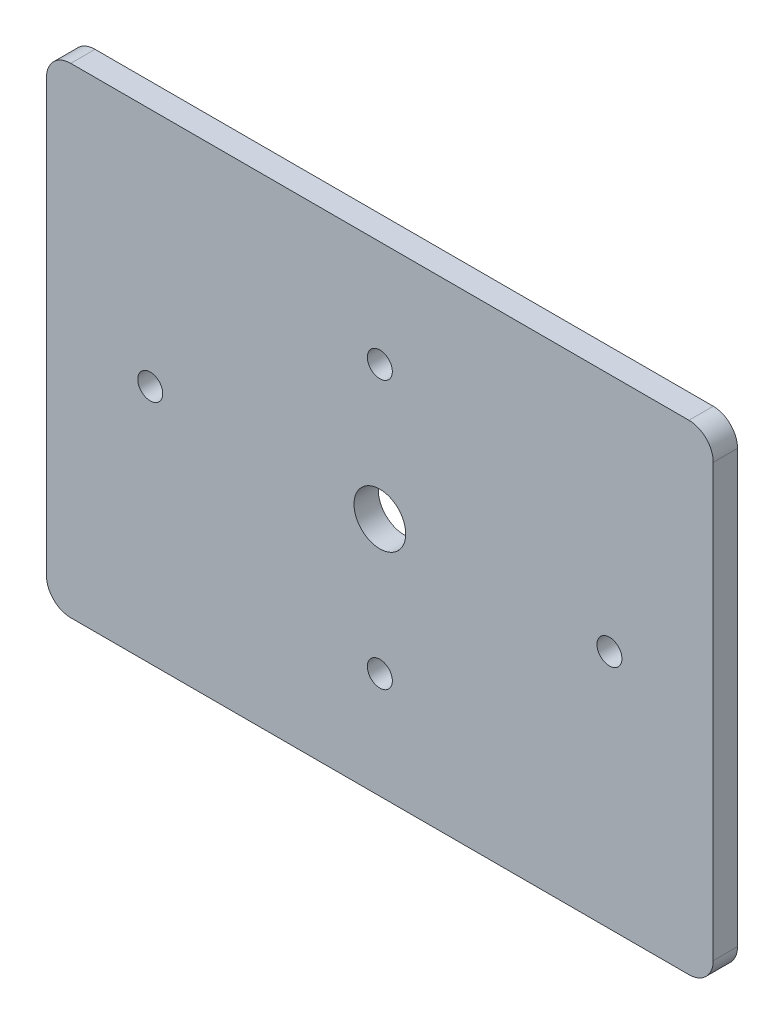
ISO-10303-21;
HEADER;
FILE_DESCRIPTION(('STEP AP214'),'2;1');
FILE_NAME('part.step','',(''),(''),'','','');
FILE_SCHEMA(('AUTOMOTIVE_DESIGN { 1 0 10303 214 1 1 1 1 }'));
ENDSEC;
DATA;
#1=APPLICATION_CONTEXT('core data for automotive mechanical design processes');
#2=APPLICATION_PROTOCOL_DEFINITION('international standard','automotive_design',2000,#1);
#3=PRODUCT_CONTEXT('',#1,'mechanical');
#4=PRODUCT('Part','Part','',(#3));
#5=PRODUCT_RELATED_PRODUCT_CATEGORY('part','',(#4));
#6=PRODUCT_DEFINITION_FORMATION('','',#4);
#7=PRODUCT_DEFINITION_CONTEXT('part definition',#1,'design');
#8=PRODUCT_DEFINITION('design','',#6,#7);
#9=PRODUCT_DEFINITION_SHAPE('','',#8);
#10=(LENGTH_UNIT() NAMED_UNIT(*) SI_UNIT(.MILLI.,.METRE.));
#11=(NAMED_UNIT(*) PLANE_ANGLE_UNIT() SI_UNIT($,.RADIAN.));
#12=(NAMED_UNIT(*) SI_UNIT($,.STERADIAN.) SOLID_ANGLE_UNIT());
#13=UNCERTAINTY_MEASURE_WITH_UNIT(LENGTH_MEASURE(1.E-05),#10,'distance_accuracy_value','');
#14=(GEOMETRIC_REPRESENTATION_CONTEXT(3) GLOBAL_UNCERTAINTY_ASSIGNED_CONTEXT((#13)) GLOBAL_UNIT_ASSIGNED_CONTEXT((#10,
#11,#12)) REPRESENTATION_CONTEXT('',''));
#15=CARTESIAN_POINT('',(0.,0.,0.));
#16=DIRECTION('',(0.,0.,1.));
#17=DIRECTION('',(1.,0.,0.));
#18=AXIS2_PLACEMENT_3D('',#15,#16,#17);
#19=CARTESIAN_POINT('',(0.,0.,3.175));
#20=DIRECTION('',(1.,0.,0.));
#21=DIRECTION('',(0.,0.,-1.));
#22=AXIS2_PLACEMENT_3D('',#19,#20,#21);
#23=PLANE('',#22);
#24=DIRECTION('',(0.,-1.,0.));
#25=VECTOR('',#24,1.);
#26=CARTESIAN_POINT('',(0.,0.,3.175));
#27=LINE('',#26,#25);
#28=CARTESIAN_POINT('',(0.,59.563,3.175));
#29=VERTEX_POINT('',#28);
#30=CARTESIAN_POINT('',(0.,3.175,3.175));
#31=VERTEX_POINT('',#30);
#32=EDGE_CURVE('E126',#29,#31,#27,.T.);
#33=ORIENTED_EDGE('',*,*,#32,.F.);
#34=DIRECTION('',(0.,0.,-1.));
#35=VECTOR('',#34,1.);
#36=CARTESIAN_POINT('',(0.,59.563,3.175));
#37=LINE('',#36,#35);
#38=CARTESIAN_POINT('',(0.,59.563,0.));
#39=VERTEX_POINT('',#38);
#40=EDGE_CURVE('E110',#29,#39,#37,.T.);
#41=ORIENTED_EDGE('',*,*,#40,.T.);
#42=DIRECTION('',(0.,-1.,0.));
#43=VECTOR('',#42,1.);
#44=CARTESIAN_POINT('',(0.,0.,0.));
#45=LINE('',#44,#43);
#46=CARTESIAN_POINT('',(0.,3.175,0.));
#47=VERTEX_POINT('',#46);
#48=EDGE_CURVE('E123',#39,#47,#45,.T.);
#49=ORIENTED_EDGE('',*,*,#48,.T.);
#50=DIRECTION('',(0.,0.,-1.));
#51=VECTOR('',#50,1.);
#52=CARTESIAN_POINT('',(0.,3.175,3.175));
#53=LINE('',#52,#51);
#54=EDGE_CURVE('E129',#47,#31,#53,.F.);
#55=ORIENTED_EDGE('',*,*,#54,.T.);
#56=EDGE_LOOP('',(#33,#41,#49,#55));
#57=FACE_BOUND('',#56,.T.);
#58=ADVANCED_FACE('F39',(#57),#23,.F.);
#59=CARTESIAN_POINT('',(0.,0.,3.175));
#60=DIRECTION('',(0.,1.,0.));
#61=DIRECTION('',(0.,0.,1.));
#62=AXIS2_PLACEMENT_3D('',#59,#60,#61);
#63=PLANE('',#62);
#64=DIRECTION('',(1.,0.,0.));
#65=VECTOR('',#64,1.);
#66=CARTESIAN_POINT('',(0.,0.,3.175));
#67=LINE('',#66,#65);
#68=CARTESIAN_POINT('',(3.175,0.,3.175));
#69=VERTEX_POINT('',#68);
#70=CARTESIAN_POINT('',(83.947,0.,3.175));
#71=VERTEX_POINT('',#70);
#72=EDGE_CURVE('E191',#69,#71,#67,.T.);
#73=ORIENTED_EDGE('',*,*,#72,.F.);
#74=DIRECTION('',(0.,0.,-1.));
#75=VECTOR('',#74,1.);
#76=CARTESIAN_POINT('',(3.175,0.,3.175));
#77=LINE('',#76,#75);
#78=CARTESIAN_POINT('',(3.175,0.,0.));
#79=VERTEX_POINT('',#78);
#80=EDGE_CURVE('E182',#69,#79,#77,.T.);
#81=ORIENTED_EDGE('',*,*,#80,.T.);
#82=DIRECTION('',(1.,0.,0.));
#83=VECTOR('',#82,1.);
#84=CARTESIAN_POINT('',(0.,0.,0.));
#85=LINE('',#84,#83);
#86=CARTESIAN_POINT('',(83.947,0.,0.));
#87=VERTEX_POINT('',#86);
#88=EDGE_CURVE('E134',#79,#87,#85,.T.);
#89=ORIENTED_EDGE('',*,*,#88,.T.);
#90=DIRECTION('',(0.,0.,-1.));
#91=VECTOR('',#90,1.);
#92=CARTESIAN_POINT('',(83.947,0.,3.175));
#93=LINE('',#92,#91);
#94=EDGE_CURVE('E179',#87,#71,#93,.F.);
#95=ORIENTED_EDGE('',*,*,#94,.T.);
#96=EDGE_LOOP('',(#73,#81,#89,#95));
#97=FACE_BOUND('',#96,.T.);
#98=ADVANCED_FACE('F260',(#97),#63,.F.);
#99=CARTESIAN_POINT('',(87.122,0.,3.175));
#100=DIRECTION('',(-1.,0.,0.));
#101=DIRECTION('',(0.,0.,1.));
#102=AXIS2_PLACEMENT_3D('',#99,#100,#101);
#103=PLANE('',#102);
#104=DIRECTION('',(0.,1.,0.));
#105=VECTOR('',#104,1.);
#106=CARTESIAN_POINT('',(87.122,0.,3.175));
#107=LINE('',#106,#105);
#108=CARTESIAN_POINT('',(87.122,3.175,3.175));
#109=VERTEX_POINT('',#108);
#110=CARTESIAN_POINT('',(87.122,59.563,3.175));
#111=VERTEX_POINT('',#110);
#112=EDGE_CURVE('E189',#109,#111,#107,.T.);
#113=ORIENTED_EDGE('',*,*,#112,.F.);
#114=DIRECTION('',(0.,0.,-1.));
#115=VECTOR('',#114,1.);
#116=CARTESIAN_POINT('',(87.122,3.175,3.175));
#117=LINE('',#116,#115);
#118=CARTESIAN_POINT('',(87.122,3.175,0.));
#119=VERTEX_POINT('',#118);
#120=EDGE_CURVE('E11',#109,#119,#117,.T.);
#121=ORIENTED_EDGE('',*,*,#120,.T.);
#122=DIRECTION('',(0.,1.,0.));
#123=VECTOR('',#122,1.);
#124=CARTESIAN_POINT('',(87.122,0.,0.));
#125=LINE('',#124,#123);
#126=CARTESIAN_POINT('',(87.122,59.563,0.));
#127=VERTEX_POINT('',#126);
#128=EDGE_CURVE('E140',#119,#127,#125,.T.);
#129=ORIENTED_EDGE('',*,*,#128,.T.);
#130=DIRECTION('',(0.,0.,-1.));
#131=VECTOR('',#130,1.);
#132=CARTESIAN_POINT('',(87.122,59.563,3.175));
#133=LINE('',#132,#131);
#134=EDGE_CURVE('E48',#127,#111,#133,.F.);
#135=ORIENTED_EDGE('',*,*,#134,.T.);
#136=EDGE_LOOP('',(#113,#121,#129,#135));
#137=FACE_BOUND('',#136,.T.);
#138=ADVANCED_FACE('F253',(#137),#103,.F.);
#139=CARTESIAN_POINT('',(0.,62.738,3.175));
#140=DIRECTION('',(0.,-1.,0.));
#141=DIRECTION('',(0.,0.,-1.));
#142=AXIS2_PLACEMENT_3D('',#139,#140,#141);
#143=PLANE('',#142);
#144=DIRECTION('',(-1.,0.,0.));
#145=VECTOR('',#144,1.);
#146=CARTESIAN_POINT('',(0.,62.738,0.));
#147=LINE('',#146,#145);
#148=CARTESIAN_POINT('',(83.947,62.738,0.));
#149=VERTEX_POINT('',#148);
#150=CARTESIAN_POINT('',(3.175,62.738,0.));
#151=VERTEX_POINT('',#150);
#152=EDGE_CURVE('E151',#149,#151,#147,.T.);
#153=ORIENTED_EDGE('',*,*,#152,.T.);
#154=DIRECTION('',(0.,0.,-1.));
#155=VECTOR('',#154,1.);
#156=CARTESIAN_POINT('',(3.175,62.738,3.175));
#157=LINE('',#156,#155);
#158=CARTESIAN_POINT('',(3.175,62.738,3.175));
#159=VERTEX_POINT('',#158);
#160=EDGE_CURVE('E111',#151,#159,#157,.F.);
#161=ORIENTED_EDGE('',*,*,#160,.T.);
#162=DIRECTION('',(-1.,0.,0.));
#163=VECTOR('',#162,1.);
#164=CARTESIAN_POINT('',(0.,62.738,3.175));
#165=LINE('',#164,#163);
#166=CARTESIAN_POINT('',(83.947,62.738,3.175));
#167=VERTEX_POINT('',#166);
#168=EDGE_CURVE('E146',#167,#159,#165,.T.);
#169=ORIENTED_EDGE('',*,*,#168,.F.);
#170=DIRECTION('',(0.,0.,-1.));
#171=VECTOR('',#170,1.);
#172=CARTESIAN_POINT('',(83.947,62.738,3.175));
#173=LINE('',#172,#171);
#174=EDGE_CURVE('E117',#167,#149,#173,.T.);
#175=ORIENTED_EDGE('',*,*,#174,.T.);
#176=EDGE_LOOP('',(#153,#161,#169,#175));
#177=FACE_BOUND('',#176,.T.);
#178=ADVANCED_FACE('F238',(#177),#143,.F.);
#179=CARTESIAN_POINT('',(0.,0.,3.175));
#180=DIRECTION('',(0.,0.,-1.));
#181=DIRECTION('',(-1.,0.,0.));
#182=AXIS2_PLACEMENT_3D('',#179,#180,#181);
#183=PLANE('',#182);
#184=CARTESIAN_POINT('',(43.561,31.369,3.175));
#185=DIRECTION('',(0.,0.,1.));
#186=DIRECTION('',(1.,0.,0.));
#187=AXIS2_PLACEMENT_3D('',#184,#185,#186);
#188=CIRCLE('',#187,3.3782);
#189=CARTESIAN_POINT('',(46.9392,31.369,3.175));
#190=VERTEX_POINT('',#189);
#191=EDGE_CURVE('E228',#190,#190,#188,.T.);
#192=ORIENTED_EDGE('',*,*,#191,.F.);
#193=EDGE_LOOP('',(#192));
#194=FACE_BOUND('',#193,.T.);
#195=CARTESIAN_POINT('',(73.561,31.369,3.175));
#196=DIRECTION('',(0.,0.,1.));
#197=DIRECTION('',(1.,0.,0.));
#198=AXIS2_PLACEMENT_3D('',#195,#196,#197);
#199=CIRCLE('',#198,1.63194999999999);
#200=CARTESIAN_POINT('',(75.19295,31.369,3.175));
#201=VERTEX_POINT('',#200);
#202=EDGE_CURVE('E220',#201,#201,#199,.T.);
#203=ORIENTED_EDGE('',*,*,#202,.F.);
#204=EDGE_LOOP('',(#203));
#205=FACE_BOUND('',#204,.T.);
#206=CARTESIAN_POINT('',(13.561,31.369,3.175));
#207=DIRECTION('',(0.,0.,1.));
#208=DIRECTION('',(1.,0.,0.));
#209=AXIS2_PLACEMENT_3D('',#206,#207,#208);
#210=CIRCLE('',#209,1.63195);
#211=CARTESIAN_POINT('',(15.19295,31.369,3.175));
#212=VERTEX_POINT('',#211);
#213=EDGE_CURVE('E212',#212,#212,#210,.T.);
#214=ORIENTED_EDGE('',*,*,#213,.F.);
#215=EDGE_LOOP('',(#214));
#216=FACE_BOUND('',#215,.T.);
#217=CARTESIAN_POINT('',(43.561,48.869,3.175));
#218=DIRECTION('',(0.,0.,1.));
#219=DIRECTION('',(1.,0.,0.));
#220=AXIS2_PLACEMENT_3D('',#217,#218,#219);
#221=CIRCLE('',#220,1.63195);
#222=CARTESIAN_POINT('',(45.19295,48.869,3.175));
#223=VERTEX_POINT('',#222);
#224=EDGE_CURVE('E204',#223,#223,#221,.T.);
#225=ORIENTED_EDGE('',*,*,#224,.F.);
#226=EDGE_LOOP('',(#225));
#227=FACE_BOUND('',#226,.T.);
#228=CARTESIAN_POINT('',(43.561,13.869,3.175));
#229=DIRECTION('',(0.,0.,1.));
#230=DIRECTION('',(1.,0.,0.));
#231=AXIS2_PLACEMENT_3D('',#228,#229,#230);
#232=CIRCLE('',#231,1.63195);
#233=CARTESIAN_POINT('',(45.19295,13.869,3.175));
#234=VERTEX_POINT('',#233);
#235=EDGE_CURVE('E143',#234,#234,#232,.T.);
#236=ORIENTED_EDGE('',*,*,#235,.F.);
#237=EDGE_LOOP('',(#236));
#238=FACE_BOUND('',#237,.T.);
#239=ORIENTED_EDGE('',*,*,#168,.T.);
#240=CARTESIAN_POINT('',(3.175,59.563,3.175));
#241=DIRECTION('',(0.,0.,-1.));
#242=DIRECTION('',(-1.,0.,0.));
#243=AXIS2_PLACEMENT_3D('',#240,#241,#242);
#244=CIRCLE('',#243,3.175);
#245=EDGE_CURVE('E176',#159,#29,#244,.F.);
#246=ORIENTED_EDGE('',*,*,#245,.T.);
#247=ORIENTED_EDGE('',*,*,#32,.T.);
#248=CARTESIAN_POINT('',(3.175,3.175,3.175));
#249=DIRECTION('',(0.,0.,-1.));
#250=DIRECTION('',(-1.,0.,0.));
#251=AXIS2_PLACEMENT_3D('',#248,#249,#250);
#252=CIRCLE('',#251,3.175);
#253=EDGE_CURVE('E173',#31,#69,#252,.F.);
#254=ORIENTED_EDGE('',*,*,#253,.T.);
#255=ORIENTED_EDGE('',*,*,#72,.T.);
#256=CARTESIAN_POINT('',(83.947,3.175,3.175));
#257=DIRECTION('',(0.,0.,-1.));
#258=DIRECTION('',(-1.,0.,0.));
#259=AXIS2_PLACEMENT_3D('',#256,#257,#258);
#260=CIRCLE('',#259,3.175);
#261=EDGE_CURVE('E61',#71,#109,#260,.F.);
#262=ORIENTED_EDGE('',*,*,#261,.T.);
#263=ORIENTED_EDGE('',*,*,#112,.T.);
#264=CARTESIAN_POINT('',(83.947,59.563,3.175));
#265=DIRECTION('',(0.,0.,-1.));
#266=DIRECTION('',(-1.,0.,0.));
#267=AXIS2_PLACEMENT_3D('',#264,#265,#266);
#268=CIRCLE('',#267,3.175);
#269=EDGE_CURVE('E168',#111,#167,#268,.F.);
#270=ORIENTED_EDGE('',*,*,#269,.T.);
#271=EDGE_LOOP('',(#239,#246,#247,#254,#255,#262,#263,#270));
#272=FACE_BOUND('',#271,.T.);
#273=ADVANCED_FACE('F235',(#194,#205,#216,#227,#238,#272),#183,.F.);
#274=CARTESIAN_POINT('',(0.,0.,0.));
#275=DIRECTION('',(0.,0.,-1.));
#276=DIRECTION('',(-1.,0.,0.));
#277=AXIS2_PLACEMENT_3D('',#274,#275,#276);
#278=PLANE('',#277);
#279=CARTESIAN_POINT('',(43.561,31.369,0.));
#280=DIRECTION('',(0.,0.,1.));
#281=DIRECTION('',(1.,0.,0.));
#282=AXIS2_PLACEMENT_3D('',#279,#280,#281);
#283=CIRCLE('',#282,3.3782);
#284=CARTESIAN_POINT('',(46.9392,31.369,0.));
#285=VERTEX_POINT('',#284);
#286=EDGE_CURVE('E224',#285,#285,#283,.T.);
#287=ORIENTED_EDGE('',*,*,#286,.T.);
#288=EDGE_LOOP('',(#287));
#289=FACE_BOUND('',#288,.T.);
#290=CARTESIAN_POINT('',(73.561,31.369,0.));
#291=DIRECTION('',(0.,0.,1.));
#292=DIRECTION('',(1.,0.,0.));
#293=AXIS2_PLACEMENT_3D('',#290,#291,#292);
#294=CIRCLE('',#293,1.63194999999999);
#295=CARTESIAN_POINT('',(75.19295,31.369,0.));
#296=VERTEX_POINT('',#295);
#297=EDGE_CURVE('E216',#296,#296,#294,.T.);
#298=ORIENTED_EDGE('',*,*,#297,.T.);
#299=EDGE_LOOP('',(#298));
#300=FACE_BOUND('',#299,.T.);
#301=CARTESIAN_POINT('',(13.561,31.369,0.));
#302=DIRECTION('',(0.,0.,1.));
#303=DIRECTION('',(1.,0.,0.));
#304=AXIS2_PLACEMENT_3D('',#301,#302,#303);
#305=CIRCLE('',#304,1.63195);
#306=CARTESIAN_POINT('',(15.19295,31.369,0.));
#307=VERTEX_POINT('',#306);
#308=EDGE_CURVE('E208',#307,#307,#305,.T.);
#309=ORIENTED_EDGE('',*,*,#308,.T.);
#310=EDGE_LOOP('',(#309));
#311=FACE_BOUND('',#310,.T.);
#312=CARTESIAN_POINT('',(43.561,48.869,0.));
#313=DIRECTION('',(0.,0.,1.));
#314=DIRECTION('',(1.,0.,0.));
#315=AXIS2_PLACEMENT_3D('',#312,#313,#314);
#316=CIRCLE('',#315,1.63195);
#317=CARTESIAN_POINT('',(45.19295,48.869,0.));
#318=VERTEX_POINT('',#317);
#319=EDGE_CURVE('E200',#318,#318,#316,.T.);
#320=ORIENTED_EDGE('',*,*,#319,.T.);
#321=EDGE_LOOP('',(#320));
#322=FACE_BOUND('',#321,.T.);
#323=CARTESIAN_POINT('',(43.561,13.869,0.));
#324=DIRECTION('',(0.,0.,1.));
#325=DIRECTION('',(1.,0.,0.));
#326=AXIS2_PLACEMENT_3D('',#323,#324,#325);
#327=CIRCLE('',#326,1.63195);
#328=CARTESIAN_POINT('',(45.19295,13.869,0.));
#329=VERTEX_POINT('',#328);
#330=EDGE_CURVE('E135',#329,#329,#327,.T.);
#331=ORIENTED_EDGE('',*,*,#330,.T.);
#332=EDGE_LOOP('',(#331));
#333=FACE_BOUND('',#332,.T.);
#334=ORIENTED_EDGE('',*,*,#48,.F.);
#335=CARTESIAN_POINT('',(3.175,59.563,0.));
#336=DIRECTION('',(0.,0.,-1.));
#337=DIRECTION('',(-1.,0.,0.));
#338=AXIS2_PLACEMENT_3D('',#335,#336,#337);
#339=CIRCLE('',#338,3.175);
#340=EDGE_CURVE('E106',#39,#151,#339,.T.);
#341=ORIENTED_EDGE('',*,*,#340,.T.);
#342=ORIENTED_EDGE('',*,*,#152,.F.);
#343=CARTESIAN_POINT('',(83.947,59.563,0.));
#344=DIRECTION('',(0.,0.,-1.));
#345=DIRECTION('',(-1.,0.,0.));
#346=AXIS2_PLACEMENT_3D('',#343,#344,#345);
#347=CIRCLE('',#346,3.175);
#348=EDGE_CURVE('E128',#149,#127,#347,.T.);
#349=ORIENTED_EDGE('',*,*,#348,.T.);
#350=ORIENTED_EDGE('',*,*,#128,.F.);
#351=CARTESIAN_POINT('',(83.947,3.175,0.));
#352=DIRECTION('',(0.,0.,-1.));
#353=DIRECTION('',(-1.,0.,0.));
#354=AXIS2_PLACEMENT_3D('',#351,#352,#353);
#355=CIRCLE('',#354,3.175);
#356=EDGE_CURVE('E158',#119,#87,#355,.T.);
#357=ORIENTED_EDGE('',*,*,#356,.T.);
#358=ORIENTED_EDGE('',*,*,#88,.F.);
#359=CARTESIAN_POINT('',(3.175,3.175,0.));
#360=DIRECTION('',(0.,0.,-1.));
#361=DIRECTION('',(-1.,0.,0.));
#362=AXIS2_PLACEMENT_3D('',#359,#360,#361);
#363=CIRCLE('',#362,3.175);
#364=EDGE_CURVE('E118',#79,#47,#363,.T.);
#365=ORIENTED_EDGE('',*,*,#364,.T.);
#366=EDGE_LOOP('',(#334,#341,#342,#349,#350,#357,#358,#365));
#367=FACE_BOUND('',#366,.T.);
#368=ADVANCED_FACE('F131',(#289,#300,#311,#322,#333,#367),#278,.T.);
#369=CARTESIAN_POINT('',(43.561,13.869,3.175));
#370=DIRECTION('',(0.,0.,1.));
#371=DIRECTION('',(1.,0.,0.));
#372=AXIS2_PLACEMENT_3D('',#369,#370,#371);
#373=CYLINDRICAL_SURFACE('',#372,1.63195);
#374=ORIENTED_EDGE('',*,*,#330,.F.);
#375=EDGE_LOOP('',(#374));
#376=FACE_BOUND('',#375,.T.);
#377=ORIENTED_EDGE('',*,*,#235,.T.);
#378=EDGE_LOOP('',(#377));
#379=FACE_BOUND('',#378,.T.);
#380=ADVANCED_FACE('F283',(#376,#379),#373,.F.);
#381=CARTESIAN_POINT('',(43.561,48.869,3.175));
#382=DIRECTION('',(0.,0.,1.));
#383=DIRECTION('',(1.,0.,0.));
#384=AXIS2_PLACEMENT_3D('',#381,#382,#383);
#385=CYLINDRICAL_SURFACE('',#384,1.63195);
#386=ORIENTED_EDGE('',*,*,#319,.F.);
#387=EDGE_LOOP('',(#386));
#388=FACE_BOUND('',#387,.T.);
#389=ORIENTED_EDGE('',*,*,#224,.T.);
#390=EDGE_LOOP('',(#389));
#391=FACE_BOUND('',#390,.T.);
#392=ADVANCED_FACE('F288',(#388,#391),#385,.F.);
#393=CARTESIAN_POINT('',(13.561,31.369,3.175));
#394=DIRECTION('',(0.,0.,1.));
#395=DIRECTION('',(1.,0.,0.));
#396=AXIS2_PLACEMENT_3D('',#393,#394,#395);
#397=CYLINDRICAL_SURFACE('',#396,1.63195);
#398=ORIENTED_EDGE('',*,*,#308,.F.);
#399=EDGE_LOOP('',(#398));
#400=FACE_BOUND('',#399,.T.);
#401=ORIENTED_EDGE('',*,*,#213,.T.);
#402=EDGE_LOOP('',(#401));
#403=FACE_BOUND('',#402,.T.);
#404=ADVANCED_FACE('F292',(#400,#403),#397,.F.);
#405=CARTESIAN_POINT('',(73.561,31.369,3.175));
#406=DIRECTION('',(0.,0.,1.));
#407=DIRECTION('',(1.,0.,0.));
#408=AXIS2_PLACEMENT_3D('',#405,#406,#407);
#409=CYLINDRICAL_SURFACE('',#408,1.63194999999999);
#410=ORIENTED_EDGE('',*,*,#297,.F.);
#411=EDGE_LOOP('',(#410));
#412=FACE_BOUND('',#411,.T.);
#413=ORIENTED_EDGE('',*,*,#202,.T.);
#414=EDGE_LOOP('',(#413));
#415=FACE_BOUND('',#414,.T.);
#416=ADVANCED_FACE('F296',(#412,#415),#409,.F.);
#417=CARTESIAN_POINT('',(43.561,31.369,3.175));
#418=DIRECTION('',(0.,0.,1.));
#419=DIRECTION('',(1.,0.,0.));
#420=AXIS2_PLACEMENT_3D('',#417,#418,#419);
#421=CYLINDRICAL_SURFACE('',#420,3.3782);
#422=ORIENTED_EDGE('',*,*,#286,.F.);
#423=EDGE_LOOP('',(#422));
#424=FACE_BOUND('',#423,.T.);
#425=ORIENTED_EDGE('',*,*,#191,.T.);
#426=EDGE_LOOP('',(#425));
#427=FACE_BOUND('',#426,.T.);
#428=ADVANCED_FACE('F233',(#424,#427),#421,.F.);
#429=CARTESIAN_POINT('',(3.175,59.563,3.175));
#430=DIRECTION('',(0.,0.,-1.));
#431=DIRECTION('',(-1.,0.,0.));
#432=AXIS2_PLACEMENT_3D('',#429,#430,#431);
#433=CYLINDRICAL_SURFACE('',#432,3.175);
#434=ORIENTED_EDGE('',*,*,#245,.F.);
#435=ORIENTED_EDGE('',*,*,#160,.F.);
#436=ORIENTED_EDGE('',*,*,#340,.F.);
#437=ORIENTED_EDGE('',*,*,#40,.F.);
#438=EDGE_LOOP('',(#434,#435,#436,#437));
#439=FACE_BOUND('',#438,.T.);
#440=ADVANCED_FACE('F109',(#439),#433,.T.);
#441=CARTESIAN_POINT('',(3.175,3.175,3.175));
#442=DIRECTION('',(0.,0.,-1.));
#443=DIRECTION('',(-1.,0.,0.));
#444=AXIS2_PLACEMENT_3D('',#441,#442,#443);
#445=CYLINDRICAL_SURFACE('',#444,3.175);
#446=ORIENTED_EDGE('',*,*,#253,.F.);
#447=ORIENTED_EDGE('',*,*,#54,.F.);
#448=ORIENTED_EDGE('',*,*,#364,.F.);
#449=ORIENTED_EDGE('',*,*,#80,.F.);
#450=EDGE_LOOP('',(#446,#447,#448,#449));
#451=FACE_BOUND('',#450,.T.);
#452=ADVANCED_FACE('F263',(#451),#445,.T.);
#453=CARTESIAN_POINT('',(83.947,3.175,3.175));
#454=DIRECTION('',(0.,0.,-1.));
#455=DIRECTION('',(-1.,0.,0.));
#456=AXIS2_PLACEMENT_3D('',#453,#454,#455);
#457=CYLINDRICAL_SURFACE('',#456,3.175);
#458=ORIENTED_EDGE('',*,*,#261,.F.);
#459=ORIENTED_EDGE('',*,*,#94,.F.);
#460=ORIENTED_EDGE('',*,*,#356,.F.);
#461=ORIENTED_EDGE('',*,*,#120,.F.);
#462=EDGE_LOOP('',(#458,#459,#460,#461));
#463=FACE_BOUND('',#462,.T.);
#464=ADVANCED_FACE('F256',(#463),#457,.T.);
#465=CARTESIAN_POINT('',(83.947,59.563,3.175));
#466=DIRECTION('',(0.,0.,-1.));
#467=DIRECTION('',(-1.,0.,0.));
#468=AXIS2_PLACEMENT_3D('',#465,#466,#467);
#469=CYLINDRICAL_SURFACE('',#468,3.175);
#470=ORIENTED_EDGE('',*,*,#269,.F.);
#471=ORIENTED_EDGE('',*,*,#134,.F.);
#472=ORIENTED_EDGE('',*,*,#348,.F.);
#473=ORIENTED_EDGE('',*,*,#174,.F.);
#474=EDGE_LOOP('',(#470,#471,#472,#473));
#475=FACE_BOUND('',#474,.T.);
#476=ADVANCED_FACE('F41',(#475),#469,.T.);
#477=CLOSED_SHELL('',(#58,#98,#138,#178,#273,#368,#380,#392,#404,#416,#428,#440,#452,#464,#476));
#478=MANIFOLD_SOLID_BREP('B2',#477);
#479=ADVANCED_BREP_SHAPE_REPRESENTATION('',(#18,#478),#14);
#480=SHAPE_DEFINITION_REPRESENTATION(#9,#479);
ENDSEC;
END-ISO-10303-21;
